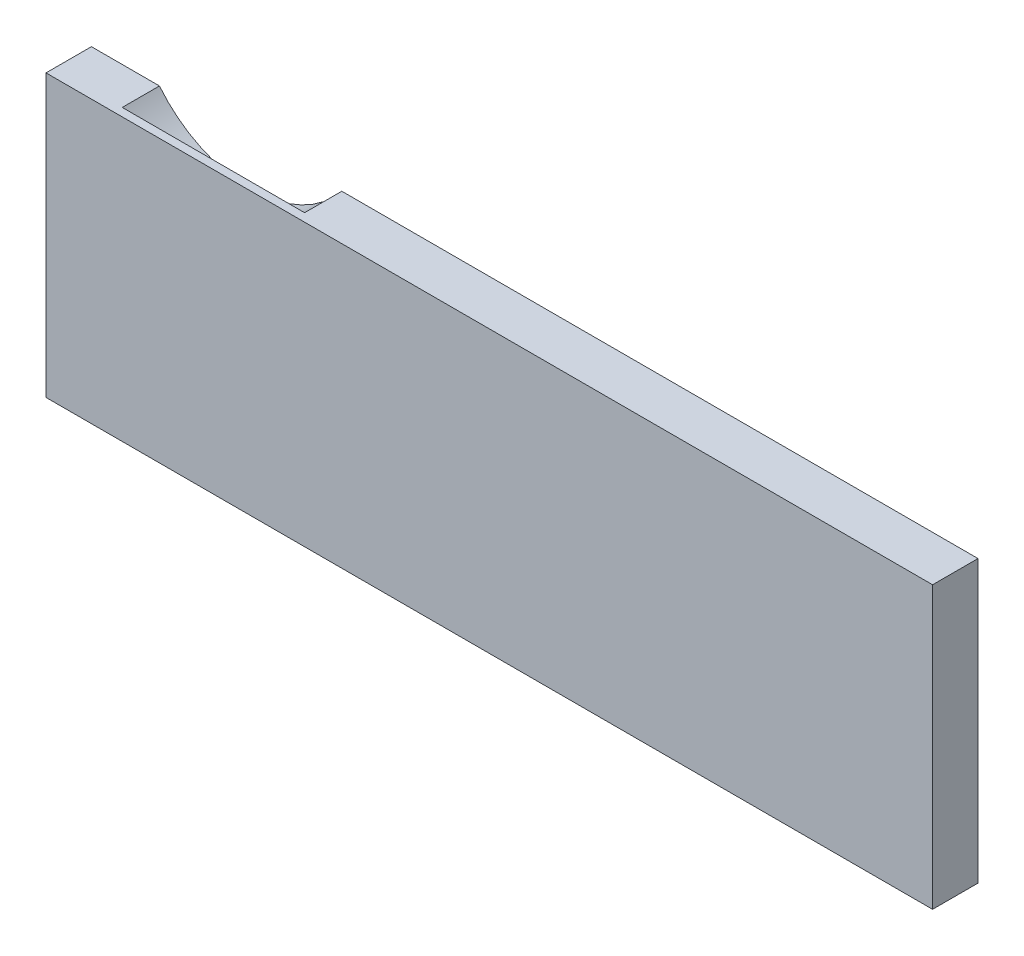
ISO-10303-21;
HEADER;
FILE_DESCRIPTION(('STEP AP214'),'2;1');
FILE_NAME('part.step','',(''),(''),'','','');
FILE_SCHEMA(('AUTOMOTIVE_DESIGN { 1 0 10303 214 1 1 1 1 }'));
ENDSEC;
DATA;
#1=APPLICATION_CONTEXT('core data for automotive mechanical design processes');
#2=APPLICATION_PROTOCOL_DEFINITION('international standard','automotive_design',2000,#1);
#3=PRODUCT_CONTEXT('',#1,'mechanical');
#4=PRODUCT('Part','Part','',(#3));
#5=PRODUCT_RELATED_PRODUCT_CATEGORY('part','',(#4));
#6=PRODUCT_DEFINITION_FORMATION('','',#4);
#7=PRODUCT_DEFINITION_CONTEXT('part definition',#1,'design');
#8=PRODUCT_DEFINITION('design','',#6,#7);
#9=PRODUCT_DEFINITION_SHAPE('','',#8);
#10=(LENGTH_UNIT() NAMED_UNIT(*) SI_UNIT(.MILLI.,.METRE.));
#11=(NAMED_UNIT(*) PLANE_ANGLE_UNIT() SI_UNIT($,.RADIAN.));
#12=(NAMED_UNIT(*) SI_UNIT($,.STERADIAN.) SOLID_ANGLE_UNIT());
#13=UNCERTAINTY_MEASURE_WITH_UNIT(LENGTH_MEASURE(1.E-05),#10,'distance_accuracy_value','');
#14=(GEOMETRIC_REPRESENTATION_CONTEXT(3) GLOBAL_UNCERTAINTY_ASSIGNED_CONTEXT((#13)) GLOBAL_UNIT_ASSIGNED_CONTEXT((#10,
#11,#12)) REPRESENTATION_CONTEXT('',''));
#15=CARTESIAN_POINT('',(0.,0.,0.));
#16=DIRECTION('',(0.,0.,1.));
#17=DIRECTION('',(1.,0.,0.));
#18=AXIS2_PLACEMENT_3D('',#15,#16,#17);
#19=CARTESIAN_POINT('',(0.,33.02,5.334));
#20=DIRECTION('',(0.,-1.,0.));
#21=DIRECTION('',(0.,0.,-1.));
#22=AXIS2_PLACEMENT_3D('',#19,#20,#21);
#23=PLANE('',#22);
#24=DIRECTION('',(0.,0.,-1.));
#25=VECTOR('',#24,1.);
#26=CARTESIAN_POINT('',(7.99316096289746,33.02,4.3688));
#27=LINE('',#26,#25);
#28=CARTESIAN_POINT('',(7.99316096289746,33.02,0.));
#29=VERTEX_POINT('',#28);
#30=CARTESIAN_POINT('',(7.99316096289746,33.02,4.3688));
#31=VERTEX_POINT('',#30);
#32=EDGE_CURVE('E96',#29,#31,#27,.F.);
#33=ORIENTED_EDGE('',*,*,#32,.F.);
#34=DIRECTION('',(-1.,0.,0.));
#35=VECTOR('',#34,1.);
#36=CARTESIAN_POINT('',(0.,33.02,0.));
#37=LINE('',#36,#35);
#38=CARTESIAN_POINT('',(0.,33.02,0.));
#39=VERTEX_POINT('',#38);
#40=EDGE_CURVE('E77',#29,#39,#37,.T.);
#41=ORIENTED_EDGE('',*,*,#40,.T.);
#42=DIRECTION('',(0.,0.,-1.));
#43=VECTOR('',#42,1.);
#44=CARTESIAN_POINT('',(0.,33.02,5.334));
#45=LINE('',#44,#43);
#46=CARTESIAN_POINT('',(0.,33.02,5.334));
#47=VERTEX_POINT('',#46);
#48=EDGE_CURVE('E120',#47,#39,#45,.T.);
#49=ORIENTED_EDGE('',*,*,#48,.F.);
#50=DIRECTION('',(-1.,0.,0.));
#51=VECTOR('',#50,1.);
#52=CARTESIAN_POINT('',(0.,33.02,5.334));
#53=LINE('',#52,#51);
#54=CARTESIAN_POINT('',(104.14,33.02,5.334));
#55=VERTEX_POINT('',#54);
#56=EDGE_CURVE('E57',#55,#47,#53,.T.);
#57=ORIENTED_EDGE('',*,*,#56,.F.);
#58=DIRECTION('',(0.,0.,-1.));
#59=VECTOR('',#58,1.);
#60=CARTESIAN_POINT('',(104.14,33.02,5.334));
#61=LINE('',#60,#59);
#62=CARTESIAN_POINT('',(104.14,33.02,0.));
#63=VERTEX_POINT('',#62);
#64=EDGE_CURVE('E129',#55,#63,#61,.T.);
#65=ORIENTED_EDGE('',*,*,#64,.T.);
#66=CARTESIAN_POINT('',(29.4112136342938,33.02,0.));
#67=VERTEX_POINT('',#66);
#68=EDGE_CURVE('E48',#63,#67,#37,.T.);
#69=ORIENTED_EDGE('',*,*,#68,.T.);
#70=DIRECTION('',(0.,0.,-1.));
#71=VECTOR('',#70,1.);
#72=CARTESIAN_POINT('',(29.4112136342938,33.02,4.3688));
#73=LINE('',#72,#71);
#74=CARTESIAN_POINT('',(29.4112136342938,33.02,4.3688));
#75=VERTEX_POINT('',#74);
#76=EDGE_CURVE('E102',#75,#67,#73,.T.);
#77=ORIENTED_EDGE('',*,*,#76,.F.);
#78=DIRECTION('',(-1.,0.,0.));
#79=VECTOR('',#78,1.);
#80=CARTESIAN_POINT('',(0.,33.02,4.3688));
#81=LINE('',#80,#79);
#82=EDGE_CURVE('E11',#75,#31,#81,.T.);
#83=ORIENTED_EDGE('',*,*,#82,.T.);
#84=EDGE_LOOP('',(#33,#41,#49,#57,#65,#69,#77,#83));
#85=FACE_BOUND('',#84,.T.);
#86=ADVANCED_FACE('F33',(#85),#23,.F.);
#87=CARTESIAN_POINT('',(0.,0.,0.));
#88=DIRECTION('',(0.,0.,-1.));
#89=DIRECTION('',(-1.,0.,0.));
#90=AXIS2_PLACEMENT_3D('',#87,#88,#89);
#91=PLANE('',#90);
#92=CARTESIAN_POINT('',(18.7021872985956,41.630623026316,0.));
#93=DIRECTION('',(0.,0.,-1.));
#94=DIRECTION('',(-1.,0.,0.));
#95=AXIS2_PLACEMENT_3D('',#92,#93,#94);
#96=CIRCLE('',#95,13.7414);
#97=EDGE_CURVE('E41',#29,#67,#96,.F.);
#98=ORIENTED_EDGE('',*,*,#97,.T.);
#99=ORIENTED_EDGE('',*,*,#68,.F.);
#100=DIRECTION('',(0.,1.,0.));
#101=VECTOR('',#100,1.);
#102=CARTESIAN_POINT('',(104.14,0.,0.));
#103=LINE('',#102,#101);
#104=CARTESIAN_POINT('',(104.14,0.,0.));
#105=VERTEX_POINT('',#104);
#106=EDGE_CURVE('E125',#105,#63,#103,.T.);
#107=ORIENTED_EDGE('',*,*,#106,.F.);
#108=DIRECTION('',(1.,0.,0.));
#109=VECTOR('',#108,1.);
#110=CARTESIAN_POINT('',(0.,0.,0.));
#111=LINE('',#110,#109);
#112=CARTESIAN_POINT('',(0.,0.,0.));
#113=VERTEX_POINT('',#112);
#114=EDGE_CURVE('E123',#113,#105,#111,.T.);
#115=ORIENTED_EDGE('',*,*,#114,.F.);
#116=DIRECTION('',(0.,-1.,0.));
#117=VECTOR('',#116,1.);
#118=CARTESIAN_POINT('',(0.,0.,0.));
#119=LINE('',#118,#117);
#120=EDGE_CURVE('E101',#39,#113,#119,.T.);
#121=ORIENTED_EDGE('',*,*,#120,.F.);
#122=ORIENTED_EDGE('',*,*,#40,.F.);
#123=EDGE_LOOP('',(#98,#99,#107,#115,#121,#122));
#124=FACE_BOUND('',#123,.T.);
#125=CARTESIAN_POINT('',(64.319453413721,20.142181245731,0.));
#126=DIRECTION('',(0.,0.,1.));
#127=DIRECTION('',(0.463631123124594,0.886028318774421,0.));
#128=AXIS2_PLACEMENT_3D('',#125,#126,#127);
#129=CIRCLE('',#128,2.794);
#130=CARTESIAN_POINT('',(65.6148387717311,22.6177443683867,0.));
#131=VERTEX_POINT('',#130);
#132=EDGE_CURVE('E106',#131,#131,#129,.T.);
#133=ORIENTED_EDGE('',*,*,#132,.T.);
#134=EDGE_LOOP('',(#133));
#135=FACE_BOUND('',#134,.T.);
#136=ADVANCED_FACE('F136',(#124,#135),#91,.T.);
#137=CARTESIAN_POINT('',(0.,0.,5.334));
#138=DIRECTION('',(1.,0.,0.));
#139=DIRECTION('',(0.,0.,-1.));
#140=AXIS2_PLACEMENT_3D('',#137,#138,#139);
#141=PLANE('',#140);
#142=ORIENTED_EDGE('',*,*,#120,.T.);
#143=DIRECTION('',(0.,0.,-1.));
#144=VECTOR('',#143,1.);
#145=CARTESIAN_POINT('',(0.,0.,5.334));
#146=LINE('',#145,#144);
#147=CARTESIAN_POINT('',(0.,0.,5.334));
#148=VERTEX_POINT('',#147);
#149=EDGE_CURVE('E134',#148,#113,#146,.T.);
#150=ORIENTED_EDGE('',*,*,#149,.F.);
#151=DIRECTION('',(0.,-1.,0.));
#152=VECTOR('',#151,1.);
#153=CARTESIAN_POINT('',(0.,0.,5.334));
#154=LINE('',#153,#152);
#155=EDGE_CURVE('E114',#47,#148,#154,.T.);
#156=ORIENTED_EDGE('',*,*,#155,.F.);
#157=ORIENTED_EDGE('',*,*,#48,.T.);
#158=EDGE_LOOP('',(#142,#150,#156,#157));
#159=FACE_BOUND('',#158,.T.);
#160=ADVANCED_FACE('F35',(#159),#141,.F.);
#161=CARTESIAN_POINT('',(0.,0.,5.334));
#162=DIRECTION('',(0.,1.,0.));
#163=DIRECTION('',(0.,0.,1.));
#164=AXIS2_PLACEMENT_3D('',#161,#162,#163);
#165=PLANE('',#164);
#166=ORIENTED_EDGE('',*,*,#114,.T.);
#167=DIRECTION('',(0.,0.,-1.));
#168=VECTOR('',#167,1.);
#169=CARTESIAN_POINT('',(104.14,0.,5.334));
#170=LINE('',#169,#168);
#171=CARTESIAN_POINT('',(104.14,0.,5.334));
#172=VERTEX_POINT('',#171);
#173=EDGE_CURVE('E131',#172,#105,#170,.T.);
#174=ORIENTED_EDGE('',*,*,#173,.F.);
#175=DIRECTION('',(1.,0.,0.));
#176=VECTOR('',#175,1.);
#177=CARTESIAN_POINT('',(0.,0.,5.334));
#178=LINE('',#177,#176);
#179=EDGE_CURVE('E85',#148,#172,#178,.T.);
#180=ORIENTED_EDGE('',*,*,#179,.F.);
#181=ORIENTED_EDGE('',*,*,#149,.T.);
#182=EDGE_LOOP('',(#166,#174,#180,#181));
#183=FACE_BOUND('',#182,.T.);
#184=ADVANCED_FACE('F147',(#183),#165,.F.);
#185=CARTESIAN_POINT('',(104.14,0.,5.334));
#186=DIRECTION('',(-1.,0.,0.));
#187=DIRECTION('',(0.,0.,1.));
#188=AXIS2_PLACEMENT_3D('',#185,#186,#187);
#189=PLANE('',#188);
#190=ORIENTED_EDGE('',*,*,#106,.T.);
#191=ORIENTED_EDGE('',*,*,#64,.F.);
#192=DIRECTION('',(0.,1.,0.));
#193=VECTOR('',#192,1.);
#194=CARTESIAN_POINT('',(104.14,0.,5.334));
#195=LINE('',#194,#193);
#196=EDGE_CURVE('E117',#172,#55,#195,.T.);
#197=ORIENTED_EDGE('',*,*,#196,.F.);
#198=ORIENTED_EDGE('',*,*,#173,.T.);
#199=EDGE_LOOP('',(#190,#191,#197,#198));
#200=FACE_BOUND('',#199,.T.);
#201=ADVANCED_FACE('F146',(#200),#189,.F.);
#202=CARTESIAN_POINT('',(0.,0.,5.334));
#203=DIRECTION('',(0.,0.,-1.));
#204=DIRECTION('',(-1.,0.,0.));
#205=AXIS2_PLACEMENT_3D('',#202,#203,#204);
#206=PLANE('',#205);
#207=ORIENTED_EDGE('',*,*,#155,.T.);
#208=ORIENTED_EDGE('',*,*,#179,.T.);
#209=ORIENTED_EDGE('',*,*,#196,.T.);
#210=ORIENTED_EDGE('',*,*,#56,.T.);
#211=EDGE_LOOP('',(#207,#208,#209,#210));
#212=FACE_BOUND('',#211,.T.);
#213=ADVANCED_FACE('F154',(#212),#206,.F.);
#214=CARTESIAN_POINT('',(18.7021872985956,41.630623026316,4.3688));
#215=DIRECTION('',(0.,0.,-1.));
#216=DIRECTION('',(-0.463631123124594,-0.886028318774421,0.));
#217=AXIS2_PLACEMENT_3D('',#214,#215,#216);
#218=CYLINDRICAL_SURFACE('',#217,13.7414);
#219=ORIENTED_EDGE('',*,*,#32,.T.);
#220=CARTESIAN_POINT('',(18.7021872985956,41.630623026316,4.3688));
#221=DIRECTION('',(0.,0.,1.));
#222=DIRECTION('',(0.463631123124594,0.886028318774421,0.));
#223=AXIS2_PLACEMENT_3D('',#220,#221,#222);
#224=CIRCLE('',#223,13.7414);
#225=EDGE_CURVE('E99',#31,#75,#224,.T.);
#226=ORIENTED_EDGE('',*,*,#225,.T.);
#227=ORIENTED_EDGE('',*,*,#76,.T.);
#228=ORIENTED_EDGE('',*,*,#97,.F.);
#229=EDGE_LOOP('',(#219,#226,#227,#228));
#230=FACE_BOUND('',#229,.T.);
#231=ADVANCED_FACE('F98',(#230),#218,.F.);
#232=CARTESIAN_POINT('',(18.7021872985956,41.630623026316,4.3688));
#233=DIRECTION('',(0.,0.,1.));
#234=DIRECTION('',(0.463631123124594,0.886028318774421,0.));
#235=AXIS2_PLACEMENT_3D('',#232,#233,#234);
#236=PLANE('',#235);
#237=ORIENTED_EDGE('',*,*,#225,.F.);
#238=ORIENTED_EDGE('',*,*,#82,.F.);
#239=EDGE_LOOP('',(#237,#238));
#240=FACE_BOUND('',#239,.T.);
#241=ADVANCED_FACE('F105',(#240),#236,.F.);
#242=CARTESIAN_POINT('',(64.319453413721,20.142181245731,0.711199999999999));
#243=DIRECTION('',(0.,0.,-1.));
#244=DIRECTION('',(-0.463631123124594,-0.886028318774421,0.));
#245=AXIS2_PLACEMENT_3D('',#242,#243,#244);
#246=CYLINDRICAL_SURFACE('',#245,2.794);
#247=CARTESIAN_POINT('',(64.319453413721,20.142181245731,0.711199999999999));
#248=DIRECTION('',(0.,0.,1.));
#249=DIRECTION('',(0.463631123124594,0.886028318774421,0.));
#250=AXIS2_PLACEMENT_3D('',#247,#248,#249);
#251=CIRCLE('',#250,2.794);
#252=CARTESIAN_POINT('',(65.6148387717311,22.6177443683867,0.711199999999999));
#253=VERTEX_POINT('',#252);
#254=EDGE_CURVE('E108',#253,#253,#251,.T.);
#255=ORIENTED_EDGE('',*,*,#254,.T.);
#256=EDGE_LOOP('',(#255));
#257=FACE_BOUND('',#256,.T.);
#258=ORIENTED_EDGE('',*,*,#132,.F.);
#259=EDGE_LOOP('',(#258));
#260=FACE_BOUND('',#259,.T.);
#261=ADVANCED_FACE('F166',(#257,#260),#246,.F.);
#262=CARTESIAN_POINT('',(64.319453413721,20.142181245731,0.711199999999999));
#263=DIRECTION('',(0.,0.,1.));
#264=DIRECTION('',(0.463631123124594,0.886028318774421,0.));
#265=AXIS2_PLACEMENT_3D('',#262,#263,#264);
#266=PLANE('',#265);
#267=ORIENTED_EDGE('',*,*,#254,.F.);
#268=EDGE_LOOP('',(#267));
#269=FACE_BOUND('',#268,.T.);
#270=ADVANCED_FACE('F169',(#269),#266,.F.);
#271=CLOSED_SHELL('',(#86,#136,#160,#184,#201,#213,#231,#241,#261,#270));
#272=MANIFOLD_SOLID_BREP('B2',#271);
#273=ADVANCED_BREP_SHAPE_REPRESENTATION('',(#18,#272),#14);
#274=SHAPE_DEFINITION_REPRESENTATION(#9,#273);
ENDSEC;
END-ISO-10303-21;
